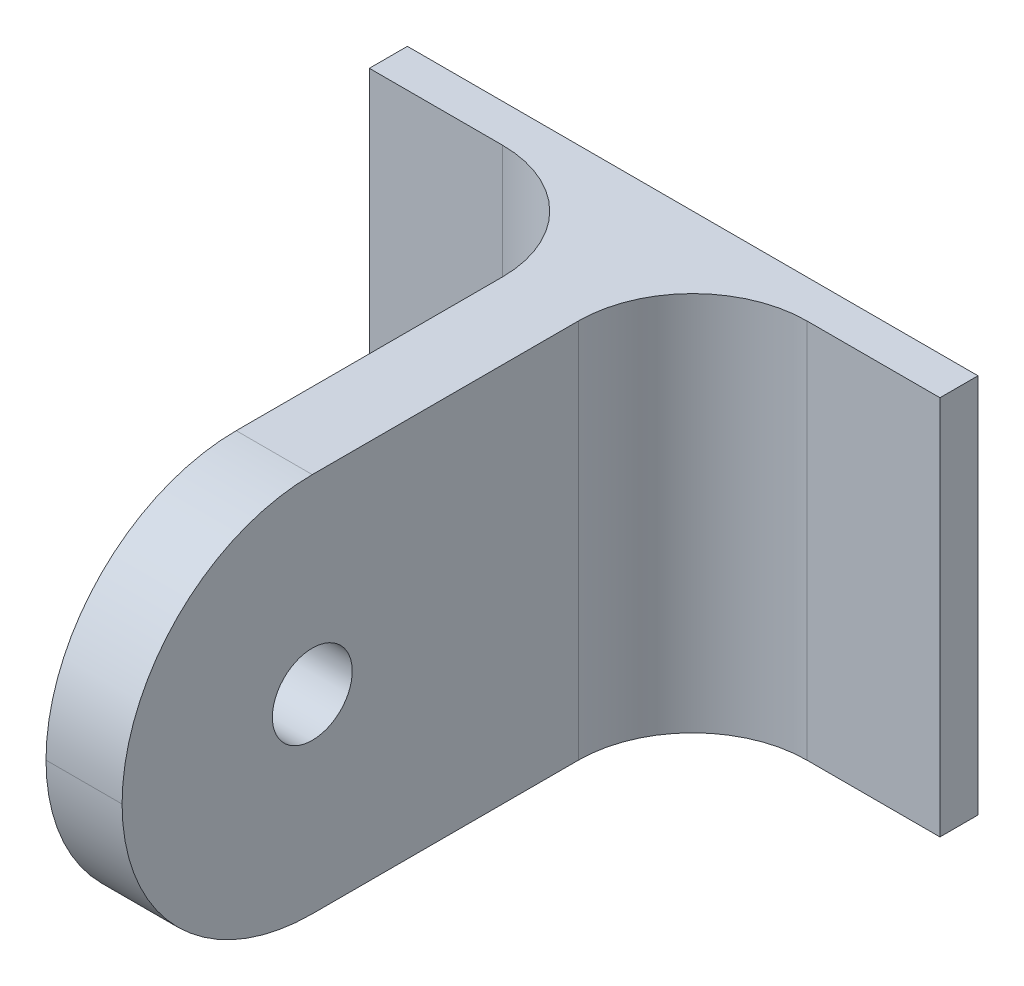
ISO-10303-21;
HEADER;
FILE_DESCRIPTION(('STEP AP214'),'2;1');
FILE_NAME('part.step','',(''),(''),'','','');
FILE_SCHEMA(('AUTOMOTIVE_DESIGN { 1 0 10303 214 1 1 1 1 }'));
ENDSEC;
DATA;
#1=APPLICATION_CONTEXT('core data for automotive mechanical design processes');
#2=APPLICATION_PROTOCOL_DEFINITION('international standard','automotive_design',2000,#1);
#3=PRODUCT_CONTEXT('',#1,'mechanical');
#4=PRODUCT('Part','Part','',(#3));
#5=PRODUCT_RELATED_PRODUCT_CATEGORY('part','',(#4));
#6=PRODUCT_DEFINITION_FORMATION('','',#4);
#7=PRODUCT_DEFINITION_CONTEXT('part definition',#1,'design');
#8=PRODUCT_DEFINITION('design','',#6,#7);
#9=PRODUCT_DEFINITION_SHAPE('','',#8);
#10=(LENGTH_UNIT() NAMED_UNIT(*) SI_UNIT(.MILLI.,.METRE.));
#11=(NAMED_UNIT(*) PLANE_ANGLE_UNIT() SI_UNIT($,.RADIAN.));
#12=(NAMED_UNIT(*) SI_UNIT($,.STERADIAN.) SOLID_ANGLE_UNIT());
#13=UNCERTAINTY_MEASURE_WITH_UNIT(LENGTH_MEASURE(1.E-05),#10,'distance_accuracy_value','');
#14=(GEOMETRIC_REPRESENTATION_CONTEXT(3) GLOBAL_UNCERTAINTY_ASSIGNED_CONTEXT((#13)) GLOBAL_UNIT_ASSIGNED_CONTEXT((#10,
#11,#12)) REPRESENTATION_CONTEXT('',''));
#15=CARTESIAN_POINT('',(0.,0.,0.));
#16=DIRECTION('',(0.,0.,1.));
#17=DIRECTION('',(1.,0.,0.));
#18=AXIS2_PLACEMENT_3D('',#15,#16,#17);
#19=CARTESIAN_POINT('',(0.,0.,2.));
#20=DIRECTION('',(0.,0.,1.));
#21=DIRECTION('',(1.,0.,0.));
#22=AXIS2_PLACEMENT_3D('',#19,#20,#21);
#23=PLANE('',#22);
#24=DIRECTION('',(1.,0.,0.));
#25=VECTOR('',#24,1.);
#26=CARTESIAN_POINT('',(-24.0566037735849,-22.8301886792453,2.));
#27=LINE('',#26,#25);
#28=CARTESIAN_POINT('',(-24.0566037735849,-22.8301886792453,2.));
#29=VERTEX_POINT('',#28);
#30=CARTESIAN_POINT('',(-17.0566037735849,-22.8301886792453,2.));
#31=VERTEX_POINT('',#30);
#32=EDGE_CURVE('E116',#29,#31,#27,.T.);
#33=ORIENTED_EDGE('',*,*,#32,.T.);
#34=DIRECTION('',(0.,-1.,0.));
#35=VECTOR('',#34,1.);
#36=CARTESIAN_POINT('',(-17.0566037735849,0.,2.));
#37=LINE('',#36,#35);
#38=CARTESIAN_POINT('',(-17.0566037735849,-2.83018867924528,2.));
#39=VERTEX_POINT('',#38);
#40=EDGE_CURVE('E173',#31,#39,#37,.F.);
#41=ORIENTED_EDGE('',*,*,#40,.T.);
#42=DIRECTION('',(-1.,0.,0.));
#43=VECTOR('',#42,1.);
#44=CARTESIAN_POINT('',(-24.0566037735849,-2.83018867924528,2.));
#45=LINE('',#44,#43);
#46=CARTESIAN_POINT('',(-24.0566037735849,-2.83018867924528,2.));
#47=VERTEX_POINT('',#46);
#48=EDGE_CURVE('E133',#39,#47,#45,.T.);
#49=ORIENTED_EDGE('',*,*,#48,.T.);
#50=DIRECTION('',(0.,-1.,0.));
#51=VECTOR('',#50,1.);
#52=CARTESIAN_POINT('',(-24.0566037735849,-2.83018867924528,2.));
#53=LINE('',#52,#51);
#54=EDGE_CURVE('E131',#47,#29,#53,.T.);
#55=ORIENTED_EDGE('',*,*,#54,.T.);
#56=EDGE_LOOP('',(#33,#41,#49,#55));
#57=FACE_BOUND('',#56,.T.);
#58=ADVANCED_FACE('F34',(#57),#23,.T.);
#59=CARTESIAN_POINT('',(-24.0566037735849,-2.83018867924528,2.));
#60=DIRECTION('',(1.,0.,0.));
#61=DIRECTION('',(0.,1.,0.));
#62=AXIS2_PLACEMENT_3D('',#59,#60,#61);
#63=PLANE('',#62);
#64=DIRECTION('',(0.,-1.,0.));
#65=VECTOR('',#64,1.);
#66=CARTESIAN_POINT('',(-24.0566037735849,-2.83018867924528,0.));
#67=LINE('',#66,#65);
#68=CARTESIAN_POINT('',(-24.0566037735849,-2.83018867924528,0.));
#69=VERTEX_POINT('',#68);
#70=CARTESIAN_POINT('',(-24.0566037735849,-22.8301886792453,0.));
#71=VERTEX_POINT('',#70);
#72=EDGE_CURVE('E141',#69,#71,#67,.T.);
#73=ORIENTED_EDGE('',*,*,#72,.T.);
#74=DIRECTION('',(0.,0.,-1.));
#75=VECTOR('',#74,1.);
#76=CARTESIAN_POINT('',(-24.0566037735849,-22.8301886792453,2.));
#77=LINE('',#76,#75);
#78=EDGE_CURVE('E121',#29,#71,#77,.T.);
#79=ORIENTED_EDGE('',*,*,#78,.F.);
#80=ORIENTED_EDGE('',*,*,#54,.F.);
#81=DIRECTION('',(0.,0.,-1.));
#82=VECTOR('',#81,1.);
#83=CARTESIAN_POINT('',(-24.0566037735849,-2.83018867924528,2.));
#84=LINE('',#83,#82);
#85=EDGE_CURVE('E228',#47,#69,#84,.T.);
#86=ORIENTED_EDGE('',*,*,#85,.T.);
#87=EDGE_LOOP('',(#73,#79,#80,#86));
#88=FACE_BOUND('',#87,.T.);
#89=ADVANCED_FACE('F139',(#88),#63,.F.);
#90=CARTESIAN_POINT('',(-24.0566037735849,-22.8301886792453,2.));
#91=DIRECTION('',(0.,1.,0.));
#92=DIRECTION('',(0.,0.,1.));
#93=AXIS2_PLACEMENT_3D('',#90,#91,#92);
#94=PLANE('',#93);
#95=DIRECTION('',(0.,0.,-1.));
#96=VECTOR('',#95,1.);
#97=CARTESIAN_POINT('',(-7.0566037735849,-22.8301886792453,32.));
#98=LINE('',#97,#96);
#99=CARTESIAN_POINT('',(-7.0566037735849,-22.8301886792453,22.));
#100=VERTEX_POINT('',#99);
#101=CARTESIAN_POINT('',(-7.0566037735849,-22.8301886792453,8.));
#102=VERTEX_POINT('',#101);
#103=EDGE_CURVE('E233',#100,#102,#98,.T.);
#104=ORIENTED_EDGE('',*,*,#103,.F.);
#105=DIRECTION('',(1.,0.,0.));
#106=VECTOR('',#105,1.);
#107=CARTESIAN_POINT('',(-11.0566037735849,-22.8301886792453,22.));
#108=LINE('',#107,#106);
#109=CARTESIAN_POINT('',(-11.0566037735849,-22.8301886792453,22.));
#110=VERTEX_POINT('',#109);
#111=EDGE_CURVE('E160',#100,#110,#108,.F.);
#112=ORIENTED_EDGE('',*,*,#111,.T.);
#113=DIRECTION('',(0.,0.,-1.));
#114=VECTOR('',#113,1.);
#115=CARTESIAN_POINT('',(-11.0566037735849,-22.8301886792453,32.));
#116=LINE('',#115,#114);
#117=CARTESIAN_POINT('',(-11.0566037735849,-22.8301886792453,8.));
#118=VERTEX_POINT('',#117);
#119=EDGE_CURVE('E240',#110,#118,#116,.T.);
#120=ORIENTED_EDGE('',*,*,#119,.T.);
#121=CARTESIAN_POINT('',(-17.0566037735849,-22.8301886792453,8.));
#122=DIRECTION('',(0.,1.,0.));
#123=DIRECTION('',(0.,0.,1.));
#124=AXIS2_PLACEMENT_3D('',#121,#122,#123);
#125=CIRCLE('',#124,6.);
#126=EDGE_CURVE('E124',#118,#31,#125,.T.);
#127=ORIENTED_EDGE('',*,*,#126,.T.);
#128=ORIENTED_EDGE('',*,*,#32,.F.);
#129=ORIENTED_EDGE('',*,*,#78,.T.);
#130=DIRECTION('',(1.,0.,0.));
#131=VECTOR('',#130,1.);
#132=CARTESIAN_POINT('',(-24.0566037735849,-22.8301886792453,0.));
#133=LINE('',#132,#131);
#134=CARTESIAN_POINT('',(5.9433962264151,-22.8301886792453,0.));
#135=VERTEX_POINT('',#134);
#136=EDGE_CURVE('E247',#71,#135,#133,.T.);
#137=ORIENTED_EDGE('',*,*,#136,.T.);
#138=DIRECTION('',(0.,0.,-1.));
#139=VECTOR('',#138,1.);
#140=CARTESIAN_POINT('',(5.9433962264151,-22.8301886792453,2.));
#141=LINE('',#140,#139);
#142=CARTESIAN_POINT('',(5.9433962264151,-22.8301886792453,2.));
#143=VERTEX_POINT('',#142);
#144=EDGE_CURVE('E143',#143,#135,#141,.T.);
#145=ORIENTED_EDGE('',*,*,#144,.F.);
#146=CARTESIAN_POINT('',(-1.05660377358491,-22.8301886792453,2.));
#147=VERTEX_POINT('',#146);
#148=EDGE_CURVE('E128',#147,#143,#27,.T.);
#149=ORIENTED_EDGE('',*,*,#148,.F.);
#150=CARTESIAN_POINT('',(-1.0566037735849,-22.8301886792453,8.));
#151=DIRECTION('',(0.,1.,0.));
#152=DIRECTION('',(0.,0.,1.));
#153=AXIS2_PLACEMENT_3D('',#150,#151,#152);
#154=CIRCLE('',#153,6.);
#155=EDGE_CURVE('E11',#147,#102,#154,.T.);
#156=ORIENTED_EDGE('',*,*,#155,.T.);
#157=EDGE_LOOP('',(#104,#112,#120,#127,#128,#129,#137,#145,#149,#156));
#158=FACE_BOUND('',#157,.T.);
#159=ADVANCED_FACE('F119',(#158),#94,.F.);
#160=CARTESIAN_POINT('',(5.94339622641509,-2.83018867924528,2.));
#161=DIRECTION('',(-1.,0.,0.));
#162=DIRECTION('',(0.,-1.,0.));
#163=AXIS2_PLACEMENT_3D('',#160,#161,#162);
#164=PLANE('',#163);
#165=DIRECTION('',(0.,1.,0.));
#166=VECTOR('',#165,1.);
#167=CARTESIAN_POINT('',(5.94339622641509,-2.83018867924528,0.));
#168=LINE('',#167,#166);
#169=CARTESIAN_POINT('',(5.94339622641509,-2.83018867924528,0.));
#170=VERTEX_POINT('',#169);
#171=EDGE_CURVE('E249',#135,#170,#168,.T.);
#172=ORIENTED_EDGE('',*,*,#171,.T.);
#173=DIRECTION('',(0.,0.,-1.));
#174=VECTOR('',#173,1.);
#175=CARTESIAN_POINT('',(5.94339622641509,-2.83018867924528,2.));
#176=LINE('',#175,#174);
#177=CARTESIAN_POINT('',(5.94339622641509,-2.83018867924528,2.));
#178=VERTEX_POINT('',#177);
#179=EDGE_CURVE('E148',#178,#170,#176,.T.);
#180=ORIENTED_EDGE('',*,*,#179,.F.);
#181=DIRECTION('',(0.,1.,0.));
#182=VECTOR('',#181,1.);
#183=CARTESIAN_POINT('',(5.94339622641509,-2.83018867924528,2.));
#184=LINE('',#183,#182);
#185=EDGE_CURVE('E127',#143,#178,#184,.T.);
#186=ORIENTED_EDGE('',*,*,#185,.F.);
#187=ORIENTED_EDGE('',*,*,#144,.T.);
#188=EDGE_LOOP('',(#172,#180,#186,#187));
#189=FACE_BOUND('',#188,.T.);
#190=ADVANCED_FACE('F222',(#189),#164,.F.);
#191=CARTESIAN_POINT('',(-24.0566037735849,-2.83018867924528,2.));
#192=DIRECTION('',(0.,-1.,0.));
#193=DIRECTION('',(0.,0.,-1.));
#194=AXIS2_PLACEMENT_3D('',#191,#192,#193);
#195=PLANE('',#194);
#196=DIRECTION('',(0.,0.,-1.));
#197=VECTOR('',#196,1.);
#198=CARTESIAN_POINT('',(-11.0566037735849,-2.83018867924528,32.));
#199=LINE('',#198,#197);
#200=CARTESIAN_POINT('',(-11.0566037735849,-2.83018867924528,22.));
#201=VERTEX_POINT('',#200);
#202=CARTESIAN_POINT('',(-11.0566037735849,-2.83018867924528,8.));
#203=VERTEX_POINT('',#202);
#204=EDGE_CURVE('E166',#201,#203,#199,.T.);
#205=ORIENTED_EDGE('',*,*,#204,.F.);
#206=DIRECTION('',(-1.,0.,0.));
#207=VECTOR('',#206,1.);
#208=CARTESIAN_POINT('',(-7.05660377358491,-2.83018867924528,22.));
#209=LINE('',#208,#207);
#210=CARTESIAN_POINT('',(-7.05660377358491,-2.83018867924528,22.));
#211=VERTEX_POINT('',#210);
#212=EDGE_CURVE('E153',#201,#211,#209,.F.);
#213=ORIENTED_EDGE('',*,*,#212,.T.);
#214=DIRECTION('',(0.,0.,-1.));
#215=VECTOR('',#214,1.);
#216=CARTESIAN_POINT('',(-7.05660377358491,-2.83018867924528,32.));
#217=LINE('',#216,#215);
#218=CARTESIAN_POINT('',(-7.05660377358491,-2.83018867924528,8.));
#219=VERTEX_POINT('',#218);
#220=EDGE_CURVE('E192',#211,#219,#217,.T.);
#221=ORIENTED_EDGE('',*,*,#220,.T.);
#222=CARTESIAN_POINT('',(-1.05660377358491,-2.83018867924528,8.));
#223=DIRECTION('',(0.,-1.,0.));
#224=DIRECTION('',(0.,0.,-1.));
#225=AXIS2_PLACEMENT_3D('',#222,#223,#224);
#226=CIRCLE('',#225,6.);
#227=CARTESIAN_POINT('',(-1.05660377358491,-2.83018867924528,2.));
#228=VERTEX_POINT('',#227);
#229=EDGE_CURVE('E42',#219,#228,#226,.T.);
#230=ORIENTED_EDGE('',*,*,#229,.T.);
#231=EDGE_CURVE('E224',#178,#228,#45,.T.);
#232=ORIENTED_EDGE('',*,*,#231,.F.);
#233=ORIENTED_EDGE('',*,*,#179,.T.);
#234=DIRECTION('',(-1.,0.,0.));
#235=VECTOR('',#234,1.);
#236=CARTESIAN_POINT('',(-24.0566037735849,-2.83018867924528,0.));
#237=LINE('',#236,#235);
#238=EDGE_CURVE('E137',#170,#69,#237,.T.);
#239=ORIENTED_EDGE('',*,*,#238,.T.);
#240=ORIENTED_EDGE('',*,*,#85,.F.);
#241=ORIENTED_EDGE('',*,*,#48,.F.);
#242=CARTESIAN_POINT('',(-17.0566037735849,-2.83018867924528,8.));
#243=DIRECTION('',(0.,-1.,0.));
#244=DIRECTION('',(0.,0.,-1.));
#245=AXIS2_PLACEMENT_3D('',#242,#243,#244);
#246=CIRCLE('',#245,6.);
#247=EDGE_CURVE('E180',#39,#203,#246,.T.);
#248=ORIENTED_EDGE('',*,*,#247,.T.);
#249=EDGE_LOOP('',(#205,#213,#221,#230,#232,#233,#239,#240,#241,#248));
#250=FACE_BOUND('',#249,.T.);
#251=ADVANCED_FACE('F184',(#250),#195,.F.);
#252=ORIENTED_EDGE('',*,*,#231,.T.);
#253=DIRECTION('',(0.,1.,0.));
#254=VECTOR('',#253,1.);
#255=CARTESIAN_POINT('',(-1.05660377358491,0.,2.));
#256=LINE('',#255,#254);
#257=EDGE_CURVE('E55',#228,#147,#256,.F.);
#258=ORIENTED_EDGE('',*,*,#257,.T.);
#259=ORIENTED_EDGE('',*,*,#148,.T.);
#260=ORIENTED_EDGE('',*,*,#185,.T.);
#261=EDGE_LOOP('',(#252,#258,#259,#260));
#262=FACE_BOUND('',#261,.T.);
#263=ADVANCED_FACE('F208',(#262),#23,.T.);
#264=CARTESIAN_POINT('',(0.,0.,0.));
#265=DIRECTION('',(0.,0.,1.));
#266=DIRECTION('',(1.,0.,0.));
#267=AXIS2_PLACEMENT_3D('',#264,#265,#266);
#268=PLANE('',#267);
#269=ORIENTED_EDGE('',*,*,#72,.F.);
#270=ORIENTED_EDGE('',*,*,#238,.F.);
#271=ORIENTED_EDGE('',*,*,#171,.F.);
#272=ORIENTED_EDGE('',*,*,#136,.F.);
#273=EDGE_LOOP('',(#269,#270,#271,#272));
#274=FACE_BOUND('',#273,.T.);
#275=ADVANCED_FACE('F216',(#274),#268,.F.);
#276=CARTESIAN_POINT('',(-11.0566037735849,-2.83018867924528,32.));
#277=DIRECTION('',(1.,0.,0.));
#278=DIRECTION('',(0.,1.,0.));
#279=AXIS2_PLACEMENT_3D('',#276,#277,#278);
#280=PLANE('',#279);
#281=CARTESIAN_POINT('',(-11.0566037735849,-12.8301886792453,22.));
#282=DIRECTION('',(-1.,0.,0.));
#283=DIRECTION('',(0.,-1.,0.));
#284=AXIS2_PLACEMENT_3D('',#281,#282,#283);
#285=CIRCLE('',#284,2.1);
#286=CARTESIAN_POINT('',(-11.0566037735849,-14.9301886792453,22.));
#287=VERTEX_POINT('',#286);
#288=EDGE_CURVE('E170',#287,#287,#285,.T.);
#289=ORIENTED_EDGE('',*,*,#288,.F.);
#290=EDGE_LOOP('',(#289));
#291=FACE_BOUND('',#290,.T.);
#292=ORIENTED_EDGE('',*,*,#204,.T.);
#293=DIRECTION('',(0.,-1.,0.));
#294=VECTOR('',#293,1.);
#295=CARTESIAN_POINT('',(-11.0566037735849,-2.83018867924528,8.));
#296=LINE('',#295,#294);
#297=EDGE_CURVE('E162',#203,#118,#296,.T.);
#298=ORIENTED_EDGE('',*,*,#297,.T.);
#299=ORIENTED_EDGE('',*,*,#119,.F.);
#300=CARTESIAN_POINT('',(-11.0566037735849,-12.8301886792453,22.));
#301=DIRECTION('',(1.,0.,0.));
#302=DIRECTION('',(0.,1.,0.));
#303=AXIS2_PLACEMENT_3D('',#300,#301,#302);
#304=CIRCLE('',#303,10.);
#305=CARTESIAN_POINT('',(-11.0566037735849,-12.8301886792453,32.));
#306=VERTEX_POINT('',#305);
#307=EDGE_CURVE('E142',#110,#306,#304,.F.);
#308=ORIENTED_EDGE('',*,*,#307,.T.);
#309=CARTESIAN_POINT('',(-11.0566037735849,-12.8301886792453,22.));
#310=DIRECTION('',(1.,0.,0.));
#311=DIRECTION('',(0.,1.,0.));
#312=AXIS2_PLACEMENT_3D('',#309,#310,#311);
#313=CIRCLE('',#312,10.);
#314=EDGE_CURVE('E145',#306,#201,#313,.F.);
#315=ORIENTED_EDGE('',*,*,#314,.T.);
#316=EDGE_LOOP('',(#292,#298,#299,#308,#315));
#317=FACE_BOUND('',#316,.T.);
#318=ADVANCED_FACE('F189',(#291,#317),#280,.F.);
#319=CARTESIAN_POINT('',(-7.05660377358491,-2.83018867924528,32.));
#320=DIRECTION('',(-1.,0.,0.));
#321=DIRECTION('',(0.,-1.,0.));
#322=AXIS2_PLACEMENT_3D('',#319,#320,#321);
#323=PLANE('',#322);
#324=CARTESIAN_POINT('',(-7.05660377358491,-12.8301886792453,22.));
#325=DIRECTION('',(-1.,0.,0.));
#326=DIRECTION('',(0.,-1.,0.));
#327=AXIS2_PLACEMENT_3D('',#324,#325,#326);
#328=CIRCLE('',#327,2.1);
#329=CARTESIAN_POINT('',(-7.05660377358491,-14.9301886792453,22.));
#330=VERTEX_POINT('',#329);
#331=EDGE_CURVE('E167',#330,#330,#328,.T.);
#332=ORIENTED_EDGE('',*,*,#331,.T.);
#333=EDGE_LOOP('',(#332));
#334=FACE_BOUND('',#333,.T.);
#335=ORIENTED_EDGE('',*,*,#103,.T.);
#336=DIRECTION('',(0.,1.,0.));
#337=VECTOR('',#336,1.);
#338=CARTESIAN_POINT('',(-7.05660377358491,-2.83018867924528,8.));
#339=LINE('',#338,#337);
#340=EDGE_CURVE('E175',#102,#219,#339,.T.);
#341=ORIENTED_EDGE('',*,*,#340,.T.);
#342=ORIENTED_EDGE('',*,*,#220,.F.);
#343=CARTESIAN_POINT('',(-7.05660377358491,-12.8301886792453,22.));
#344=DIRECTION('',(-1.,0.,0.));
#345=DIRECTION('',(0.,-1.,0.));
#346=AXIS2_PLACEMENT_3D('',#343,#344,#345);
#347=CIRCLE('',#346,10.);
#348=CARTESIAN_POINT('',(-7.05660377358491,-12.8301886792453,32.));
#349=VERTEX_POINT('',#348);
#350=EDGE_CURVE('E158',#211,#349,#347,.F.);
#351=ORIENTED_EDGE('',*,*,#350,.T.);
#352=CARTESIAN_POINT('',(-7.05660377358491,-12.8301886792453,22.));
#353=DIRECTION('',(-1.,0.,0.));
#354=DIRECTION('',(0.,-1.,0.));
#355=AXIS2_PLACEMENT_3D('',#352,#353,#354);
#356=CIRCLE('',#355,10.);
#357=EDGE_CURVE('E156',#349,#100,#356,.F.);
#358=ORIENTED_EDGE('',*,*,#357,.T.);
#359=EDGE_LOOP('',(#335,#341,#342,#351,#358));
#360=FACE_BOUND('',#359,.T.);
#361=ADVANCED_FACE('F237',(#334,#360),#323,.F.);
#362=CARTESIAN_POINT('',(0.,-12.8301886792453,22.));
#363=DIRECTION('',(-1.,0.,0.));
#364=DIRECTION('',(0.,0.,1.));
#365=AXIS2_PLACEMENT_3D('',#362,#363,#364);
#366=CYLINDRICAL_SURFACE('',#365,10.);
#367=ORIENTED_EDGE('',*,*,#111,.F.);
#368=ORIENTED_EDGE('',*,*,#357,.F.);
#369=DIRECTION('',(1.,0.,0.));
#370=VECTOR('',#369,1.);
#371=CARTESIAN_POINT('',(-7.0566037735849,-12.8301886792453,32.));
#372=LINE('',#371,#370);
#373=EDGE_CURVE('E163',#306,#349,#372,.T.);
#374=ORIENTED_EDGE('',*,*,#373,.F.);
#375=ORIENTED_EDGE('',*,*,#307,.F.);
#376=EDGE_LOOP('',(#367,#368,#374,#375));
#377=FACE_BOUND('',#376,.T.);
#378=ADVANCED_FACE('F263',(#377),#366,.T.);
#379=CARTESIAN_POINT('',(0.,-12.8301886792453,22.));
#380=DIRECTION('',(1.,0.,0.));
#381=DIRECTION('',(0.,0.,-1.));
#382=AXIS2_PLACEMENT_3D('',#379,#380,#381);
#383=CYLINDRICAL_SURFACE('',#382,10.);
#384=ORIENTED_EDGE('',*,*,#350,.F.);
#385=ORIENTED_EDGE('',*,*,#212,.F.);
#386=ORIENTED_EDGE('',*,*,#314,.F.);
#387=ORIENTED_EDGE('',*,*,#373,.T.);
#388=EDGE_LOOP('',(#384,#385,#386,#387));
#389=FACE_BOUND('',#388,.T.);
#390=ADVANCED_FACE('F202',(#389),#383,.T.);
#391=CARTESIAN_POINT('',(18.9433962264151,-12.8301886792453,22.));
#392=DIRECTION('',(-1.,0.,0.));
#393=DIRECTION('',(0.,-1.,0.));
#394=AXIS2_PLACEMENT_3D('',#391,#392,#393);
#395=CYLINDRICAL_SURFACE('',#394,2.1);
#396=ORIENTED_EDGE('',*,*,#288,.T.);
#397=EDGE_LOOP('',(#396));
#398=FACE_BOUND('',#397,.T.);
#399=ORIENTED_EDGE('',*,*,#331,.F.);
#400=EDGE_LOOP('',(#399));
#401=FACE_BOUND('',#400,.T.);
#402=ADVANCED_FACE('F196',(#398,#401),#395,.F.);
#403=CARTESIAN_POINT('',(-17.0566037735849,-2.83018867924528,8.));
#404=DIRECTION('',(0.,-1.,0.));
#405=DIRECTION('',(1.,0.,0.));
#406=AXIS2_PLACEMENT_3D('',#403,#404,#405);
#407=CYLINDRICAL_SURFACE('',#406,6.);
#408=ORIENTED_EDGE('',*,*,#247,.F.);
#409=ORIENTED_EDGE('',*,*,#40,.F.);
#410=ORIENTED_EDGE('',*,*,#126,.F.);
#411=ORIENTED_EDGE('',*,*,#297,.F.);
#412=EDGE_LOOP('',(#408,#409,#410,#411));
#413=FACE_BOUND('',#412,.T.);
#414=ADVANCED_FACE('F194',(#413),#407,.F.);
#415=CARTESIAN_POINT('',(-1.05660377358491,-2.83018867924528,8.));
#416=DIRECTION('',(0.,1.,0.));
#417=DIRECTION('',(-1.,0.,0.));
#418=AXIS2_PLACEMENT_3D('',#415,#416,#417);
#419=CYLINDRICAL_SURFACE('',#418,6.);
#420=ORIENTED_EDGE('',*,*,#155,.F.);
#421=ORIENTED_EDGE('',*,*,#257,.F.);
#422=ORIENTED_EDGE('',*,*,#229,.F.);
#423=ORIENTED_EDGE('',*,*,#340,.F.);
#424=EDGE_LOOP('',(#420,#421,#422,#423));
#425=FACE_BOUND('',#424,.T.);
#426=ADVANCED_FACE('F36',(#425),#419,.F.);
#427=CLOSED_SHELL('',(#58,#89,#159,#190,#251,#263,#275,#318,#361,#378,#390,#402,#414,#426));
#428=MANIFOLD_SOLID_BREP('B2',#427);
#429=ADVANCED_BREP_SHAPE_REPRESENTATION('',(#18,#428),#14);
#430=SHAPE_DEFINITION_REPRESENTATION(#9,#429);
ENDSEC;
END-ISO-10303-21;
